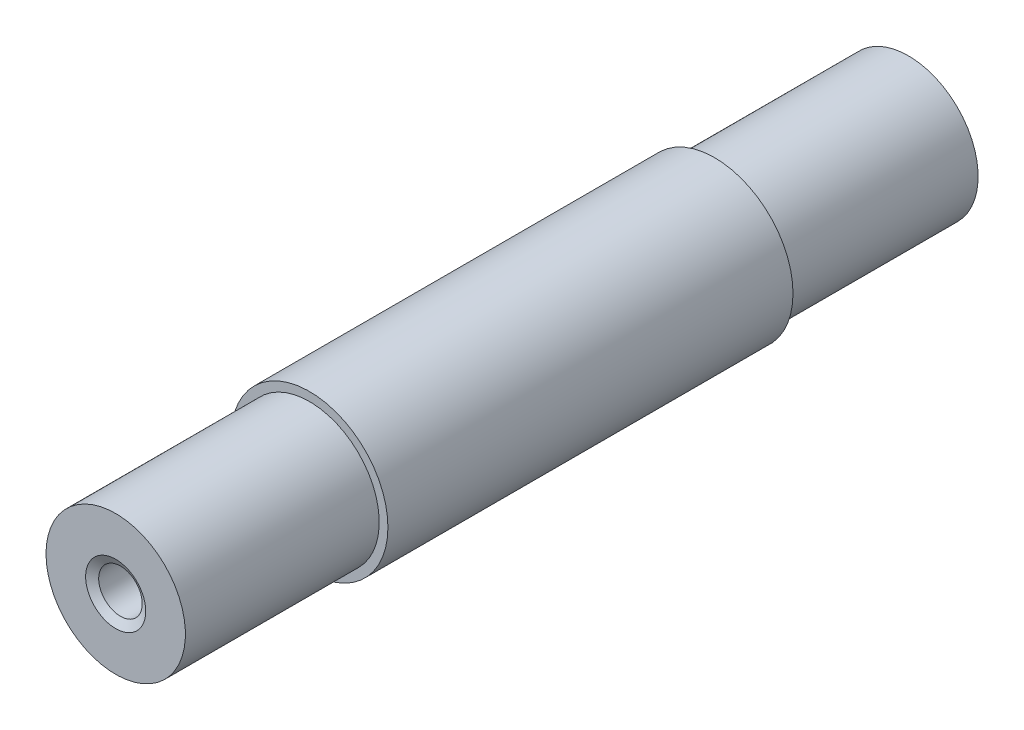
ISO-10303-21;
HEADER;
FILE_DESCRIPTION(('STEP AP214'),'2;1');
FILE_NAME('part.step','',(''),(''),'','','');
FILE_SCHEMA(('AUTOMOTIVE_DESIGN { 1 0 10303 214 1 1 1 1 }'));
ENDSEC;
DATA;
#1=APPLICATION_CONTEXT('core data for automotive mechanical design processes');
#2=APPLICATION_PROTOCOL_DEFINITION('international standard','automotive_design',2000,#1);
#3=PRODUCT_CONTEXT('',#1,'mechanical');
#4=PRODUCT('Part','Part','',(#3));
#5=PRODUCT_RELATED_PRODUCT_CATEGORY('part','',(#4));
#6=PRODUCT_DEFINITION_FORMATION('','',#4);
#7=PRODUCT_DEFINITION_CONTEXT('part definition',#1,'design');
#8=PRODUCT_DEFINITION('design','',#6,#7);
#9=PRODUCT_DEFINITION_SHAPE('','',#8);
#10=(LENGTH_UNIT() NAMED_UNIT(*) SI_UNIT(.MILLI.,.METRE.));
#11=(NAMED_UNIT(*) PLANE_ANGLE_UNIT() SI_UNIT($,.RADIAN.));
#12=(NAMED_UNIT(*) SI_UNIT($,.STERADIAN.) SOLID_ANGLE_UNIT());
#13=UNCERTAINTY_MEASURE_WITH_UNIT(LENGTH_MEASURE(1.E-05),#10,'distance_accuracy_value','');
#14=(GEOMETRIC_REPRESENTATION_CONTEXT(3) GLOBAL_UNCERTAINTY_ASSIGNED_CONTEXT((#13)) GLOBAL_UNIT_ASSIGNED_CONTEXT((#10,
#11,#12)) REPRESENTATION_CONTEXT('',''));
#15=CARTESIAN_POINT('',(0.,0.,0.));
#16=DIRECTION('',(0.,0.,1.));
#17=DIRECTION('',(1.,0.,0.));
#18=AXIS2_PLACEMENT_3D('',#15,#16,#17);
#19=CARTESIAN_POINT('',(241.510652388512,-401.151572168843,-592.587499999979));
#20=DIRECTION('',(0.,0.,1.));
#21=DIRECTION('',(1.,0.,0.));
#22=AXIS2_PLACEMENT_3D('',#19,#20,#21);
#23=CONICAL_SURFACE('',#22,2.49999999999861,1.02974425866218);
#24=CARTESIAN_POINT('',(241.510652388456,-401.151572168843,-594.089651547534));
#25=VERTEX_POINT('',#24);
#26=VERTEX_LOOP('',#25);
#27=FACE_BOUND('',#26,.T.);
#28=CARTESIAN_POINT('',(241.510652388512,-401.151572168843,-592.5875));
#29=DIRECTION('',(0.,0.,1.));
#30=DIRECTION('',(1.,0.,0.));
#31=AXIS2_PLACEMENT_3D('',#28,#29,#30);
#32=CIRCLE('',#31,2.5);
#33=CARTESIAN_POINT('',(244.010652388512,-401.151572168843,-592.5875));
#34=VERTEX_POINT('',#33);
#35=EDGE_CURVE('E37',#34,#34,#32,.T.);
#36=ORIENTED_EDGE('',*,*,#35,.T.);
#37=EDGE_LOOP('',(#36));
#38=FACE_BOUND('',#37,.T.);
#39=ADVANCED_FACE('F17',(#27,#38),#23,.F.);
#40=CARTESIAN_POINT('',(241.510652388512,-401.151572168843,-649.587499999996));
#41=DIRECTION('',(0.,0.,-1.));
#42=DIRECTION('',(-1.,0.,0.));
#43=AXIS2_PLACEMENT_3D('',#40,#41,#42);
#44=CONICAL_SURFACE('',#43,2.49999999999684,1.02974425867159);
#45=CARTESIAN_POINT('',(241.510652388456,-401.151572168843,-648.085348452383));
#46=VERTEX_POINT('',#45);
#47=VERTEX_LOOP('',#46);
#48=FACE_BOUND('',#47,.T.);
#49=CARTESIAN_POINT('',(241.510652388512,-401.151572168843,-649.5875));
#50=DIRECTION('',(0.,0.,-1.));
#51=DIRECTION('',(-1.,0.,0.));
#52=AXIS2_PLACEMENT_3D('',#49,#50,#51);
#53=CIRCLE('',#52,2.5);
#54=CARTESIAN_POINT('',(239.010652388512,-401.151572168843,-649.5875));
#55=VERTEX_POINT('',#54);
#56=EDGE_CURVE('E39',#55,#55,#53,.T.);
#57=ORIENTED_EDGE('',*,*,#56,.T.);
#58=EDGE_LOOP('',(#57));
#59=FACE_BOUND('',#58,.T.);
#60=ADVANCED_FACE('F34',(#48,#59),#44,.F.);
#61=CARTESIAN_POINT('',(241.510652388512,-401.151572168843,-575.5875));
#62=DIRECTION('',(0.,0.,1.));
#63=DIRECTION('',(1.,0.,0.));
#64=AXIS2_PLACEMENT_3D('',#61,#62,#63);
#65=CYLINDRICAL_SURFACE('',#64,2.5);
#66=ORIENTED_EDGE('',*,*,#35,.F.);
#67=EDGE_LOOP('',(#66));
#68=FACE_BOUND('',#67,.T.);
#69=CARTESIAN_POINT('',(241.510652388512,-401.151572168843,-576.135982755716));
#70=DIRECTION('',(0.,0.,1.));
#71=DIRECTION('',(1.,0.,0.));
#72=AXIS2_PLACEMENT_3D('',#69,#70,#71);
#73=CIRCLE('',#72,2.50000000005546);
#74=CARTESIAN_POINT('',(244.010652388567,-401.151572168843,-576.135982755716));
#75=VERTEX_POINT('',#74);
#76=EDGE_CURVE('E42',#75,#75,#73,.T.);
#77=ORIENTED_EDGE('',*,*,#76,.T.);
#78=EDGE_LOOP('',(#77));
#79=FACE_BOUND('',#78,.T.);
#80=ADVANCED_FACE('F74',(#68,#79),#65,.F.);
#81=CARTESIAN_POINT('',(241.510652388512,-401.151572168843,-666.5875));
#82=DIRECTION('',(0.,0.,-1.));
#83=DIRECTION('',(-1.,0.,0.));
#84=AXIS2_PLACEMENT_3D('',#81,#82,#83);
#85=CYLINDRICAL_SURFACE('',#84,2.5);
#86=ORIENTED_EDGE('',*,*,#56,.F.);
#87=EDGE_LOOP('',(#86));
#88=FACE_BOUND('',#87,.T.);
#89=CARTESIAN_POINT('',(241.510652388512,-401.151572168843,-666.039017244202));
#90=DIRECTION('',(0.,0.,-1.));
#91=DIRECTION('',(-1.,0.,0.));
#92=AXIS2_PLACEMENT_3D('',#89,#90,#91);
#93=CIRCLE('',#92,2.49999999993999);
#94=CARTESIAN_POINT('',(239.010652388572,-401.151572168843,-666.039017244202));
#95=VERTEX_POINT('',#94);
#96=EDGE_CURVE('E64',#95,#95,#93,.T.);
#97=ORIENTED_EDGE('',*,*,#96,.T.);
#98=EDGE_LOOP('',(#97));
#99=FACE_BOUND('',#98,.T.);
#100=ADVANCED_FACE('F79',(#88,#99),#85,.F.);
#101=CARTESIAN_POINT('',(241.510652388512,-401.151572168843,-575.587499999983));
#102=DIRECTION('',(0.,0.,1.));
#103=DIRECTION('',(1.,0.,0.));
#104=AXIS2_PLACEMENT_3D('',#101,#102,#103);
#105=CONICAL_SURFACE('',#104,3.45000000004436,1.04719755118969);
#106=CARTESIAN_POINT('',(241.510652388512,-401.151572168843,-575.587499999984));
#107=DIRECTION('',(0.,0.,1.));
#108=DIRECTION('',(1.,0.,0.));
#109=AXIS2_PLACEMENT_3D('',#106,#107,#108);
#110=CIRCLE('',#109,3.45000000004347);
#111=CARTESIAN_POINT('',(244.960652388555,-401.151572168843,-575.587499999984));
#112=VERTEX_POINT('',#111);
#113=EDGE_CURVE('E20',#112,#112,#110,.T.);
#114=ORIENTED_EDGE('',*,*,#113,.T.);
#115=EDGE_LOOP('',(#114));
#116=FACE_BOUND('',#115,.T.);
#117=ORIENTED_EDGE('',*,*,#76,.F.);
#118=EDGE_LOOP('',(#117));
#119=FACE_BOUND('',#118,.T.);
#120=ADVANCED_FACE('F76',(#116,#119),#105,.F.);
#121=CARTESIAN_POINT('',(241.510652388512,-401.151572168843,-666.587499999935));
#122=DIRECTION('',(0.,0.,-1.));
#123=DIRECTION('',(-1.,0.,0.));
#124=AXIS2_PLACEMENT_3D('',#121,#122,#123);
#125=CONICAL_SURFACE('',#124,3.44999999998574,1.04719755119663);
#126=CARTESIAN_POINT('',(241.510652388512,-401.151572168843,-666.587499999935));
#127=DIRECTION('',(0.,0.,-1.));
#128=DIRECTION('',(-1.,0.,0.));
#129=AXIS2_PLACEMENT_3D('',#126,#127,#128);
#130=CIRCLE('',#129,3.44999999998663);
#131=CARTESIAN_POINT('',(238.060652388525,-401.151572168843,-666.587499999935));
#132=VERTEX_POINT('',#131);
#133=EDGE_CURVE('E59',#132,#132,#130,.F.);
#134=ORIENTED_EDGE('',*,*,#133,.F.);
#135=EDGE_LOOP('',(#134));
#136=FACE_BOUND('',#135,.T.);
#137=ORIENTED_EDGE('',*,*,#96,.F.);
#138=EDGE_LOOP('',(#137));
#139=FACE_BOUND('',#138,.T.);
#140=ADVANCED_FACE('F78',(#136,#139),#125,.F.);
#141=CARTESIAN_POINT('',(476.510652388512,-354.095322168843,-575.5875));
#142=DIRECTION('',(0.,0.,-1.));
#143=DIRECTION('',(-1.,0.,0.));
#144=AXIS2_PLACEMENT_3D('',#141,#142,#143);
#145=PLANE('',#144);
#146=CARTESIAN_POINT('',(241.510652388512,-401.151572168843,-575.5875));
#147=DIRECTION('',(0.,0.,-1.));
#148=DIRECTION('',(-1.,0.,0.));
#149=AXIS2_PLACEMENT_3D('',#146,#147,#148);
#150=CIRCLE('',#149,8.);
#151=CARTESIAN_POINT('',(233.510652388512,-401.151572168843,-575.5875));
#152=VERTEX_POINT('',#151);
#153=EDGE_CURVE('E57',#152,#152,#150,.T.);
#154=ORIENTED_EDGE('',*,*,#153,.F.);
#155=EDGE_LOOP('',(#154));
#156=FACE_BOUND('',#155,.T.);
#157=ORIENTED_EDGE('',*,*,#113,.F.);
#158=EDGE_LOOP('',(#157));
#159=FACE_BOUND('',#158,.T.);
#160=ADVANCED_FACE('F86',(#156,#159),#145,.F.);
#161=CARTESIAN_POINT('',(401.510652388512,-401.151572168843,-666.5875));
#162=DIRECTION('',(0.,0.,-1.));
#163=DIRECTION('',(-1.,0.,0.));
#164=AXIS2_PLACEMENT_3D('',#161,#162,#163);
#165=PLANE('',#164);
#166=CARTESIAN_POINT('',(241.510652388512,-401.151572168843,-666.5875));
#167=DIRECTION('',(0.,0.,-1.));
#168=DIRECTION('',(-1.,0.,0.));
#169=AXIS2_PLACEMENT_3D('',#166,#167,#168);
#170=CIRCLE('',#169,8.);
#171=CARTESIAN_POINT('',(233.510652388512,-401.151572168843,-666.5875));
#172=VERTEX_POINT('',#171);
#173=EDGE_CURVE('E54',#172,#172,#170,.F.);
#174=ORIENTED_EDGE('',*,*,#173,.F.);
#175=EDGE_LOOP('',(#174));
#176=FACE_BOUND('',#175,.T.);
#177=ORIENTED_EDGE('',*,*,#133,.T.);
#178=EDGE_LOOP('',(#177));
#179=FACE_BOUND('',#178,.T.);
#180=ADVANCED_FACE('F114',(#176,#179),#165,.T.);
#181=CARTESIAN_POINT('',(241.510652388512,-401.151572168843,-686.35));
#182=DIRECTION('',(0.,0.,-1.));
#183=DIRECTION('',(-1.,0.,0.));
#184=AXIS2_PLACEMENT_3D('',#181,#182,#183);
#185=CYLINDRICAL_SURFACE('',#184,8.);
#186=CARTESIAN_POINT('',(241.510652388512,-401.151572168843,-597.8375));
#187=DIRECTION('',(0.,0.,-1.));
#188=DIRECTION('',(-1.,0.,0.));
#189=AXIS2_PLACEMENT_3D('',#186,#187,#188);
#190=CIRCLE('',#189,8.);
#191=CARTESIAN_POINT('',(233.510652388512,-401.151572168843,-597.8375));
#192=VERTEX_POINT('',#191);
#193=EDGE_CURVE('E51',#192,#192,#190,.T.);
#194=ORIENTED_EDGE('',*,*,#193,.F.);
#195=EDGE_LOOP('',(#194));
#196=FACE_BOUND('',#195,.T.);
#197=ORIENTED_EDGE('',*,*,#153,.T.);
#198=EDGE_LOOP('',(#197));
#199=FACE_BOUND('',#198,.T.);
#200=ADVANCED_FACE('F110',(#196,#199),#185,.T.);
#201=CARTESIAN_POINT('',(241.510652388512,-401.151572168843,-686.35));
#202=DIRECTION('',(0.,0.,-1.));
#203=DIRECTION('',(-1.,0.,0.));
#204=AXIS2_PLACEMENT_3D('',#201,#202,#203);
#205=CYLINDRICAL_SURFACE('',#204,8.);
#206=ORIENTED_EDGE('',*,*,#173,.T.);
#207=EDGE_LOOP('',(#206));
#208=FACE_BOUND('',#207,.T.);
#209=CARTESIAN_POINT('',(241.510652388512,-401.151572168843,-644.3375));
#210=DIRECTION('',(0.,0.,-1.));
#211=DIRECTION('',(-1.,0.,0.));
#212=AXIS2_PLACEMENT_3D('',#209,#210,#211);
#213=CIRCLE('',#212,8.);
#214=CARTESIAN_POINT('',(233.510652388512,-401.151572168843,-644.3375));
#215=VERTEX_POINT('',#214);
#216=EDGE_CURVE('E48',#215,#215,#213,.T.);
#217=ORIENTED_EDGE('',*,*,#216,.T.);
#218=EDGE_LOOP('',(#217));
#219=FACE_BOUND('',#218,.T.);
#220=ADVANCED_FACE('F106',(#208,#219),#205,.T.);
#221=CARTESIAN_POINT('',(233.010652388512,-401.151572168843,-597.8375));
#222=DIRECTION('',(0.,0.,1.));
#223=DIRECTION('',(1.,0.,0.));
#224=AXIS2_PLACEMENT_3D('',#221,#222,#223);
#225=PLANE('',#224);
#226=CARTESIAN_POINT('',(241.510652388511,-401.151572168843,-597.8375));
#227=DIRECTION('',(0.,0.,1.));
#228=DIRECTION('',(1.,0.,0.));
#229=AXIS2_PLACEMENT_3D('',#226,#227,#228);
#230=CIRCLE('',#229,8.99999999999997);
#231=CARTESIAN_POINT('',(250.510652388511,-401.151572168843,-597.8375));
#232=VERTEX_POINT('',#231);
#233=EDGE_CURVE('E26',#232,#232,#230,.F.);
#234=ORIENTED_EDGE('',*,*,#233,.F.);
#235=EDGE_LOOP('',(#234));
#236=FACE_BOUND('',#235,.T.);
#237=ORIENTED_EDGE('',*,*,#193,.T.);
#238=EDGE_LOOP('',(#237));
#239=FACE_BOUND('',#238,.T.);
#240=ADVANCED_FACE('F99',(#236,#239),#225,.T.);
#241=CARTESIAN_POINT('',(233.010652388512,-401.151572168843,-644.3375));
#242=DIRECTION('',(0.,0.,1.));
#243=DIRECTION('',(1.,0.,0.));
#244=AXIS2_PLACEMENT_3D('',#241,#242,#243);
#245=PLANE('',#244);
#246=ORIENTED_EDGE('',*,*,#216,.F.);
#247=EDGE_LOOP('',(#246));
#248=FACE_BOUND('',#247,.T.);
#249=CARTESIAN_POINT('',(241.510652388511,-401.151572168843,-644.3375));
#250=DIRECTION('',(0.,0.,1.));
#251=DIRECTION('',(1.,0.,0.));
#252=AXIS2_PLACEMENT_3D('',#249,#250,#251);
#253=CIRCLE('',#252,8.99999999999997);
#254=CARTESIAN_POINT('',(250.510652388511,-401.151572168843,-644.3375));
#255=VERTEX_POINT('',#254);
#256=EDGE_CURVE('E11',#255,#255,#253,.T.);
#257=ORIENTED_EDGE('',*,*,#256,.F.);
#258=EDGE_LOOP('',(#257));
#259=FACE_BOUND('',#258,.T.);
#260=ADVANCED_FACE('F93',(#248,#259),#245,.F.);
#261=CARTESIAN_POINT('',(241.510652388511,-401.151572168843,-621.0875));
#262=DIRECTION('',(0.,0.,1.));
#263=DIRECTION('',(1.,0.,0.));
#264=AXIS2_PLACEMENT_3D('',#261,#262,#263);
#265=CYLINDRICAL_SURFACE('',#264,8.99999999999997);
#266=ORIENTED_EDGE('',*,*,#256,.T.);
#267=EDGE_LOOP('',(#266));
#268=FACE_BOUND('',#267,.T.);
#269=ORIENTED_EDGE('',*,*,#233,.T.);
#270=EDGE_LOOP('',(#269));
#271=FACE_BOUND('',#270,.T.);
#272=ADVANCED_FACE('F91',(#268,#271),#265,.T.);
#273=CLOSED_SHELL('',(#39,#60,#80,#100,#120,#140,#160,#180,#200,#220,#240,#260,#272));
#274=MANIFOLD_SOLID_BREP('B1',#273);
#275=ADVANCED_BREP_SHAPE_REPRESENTATION('',(#18,#274),#14);
#276=SHAPE_DEFINITION_REPRESENTATION(#9,#275);
ENDSEC;
END-ISO-10303-21;
